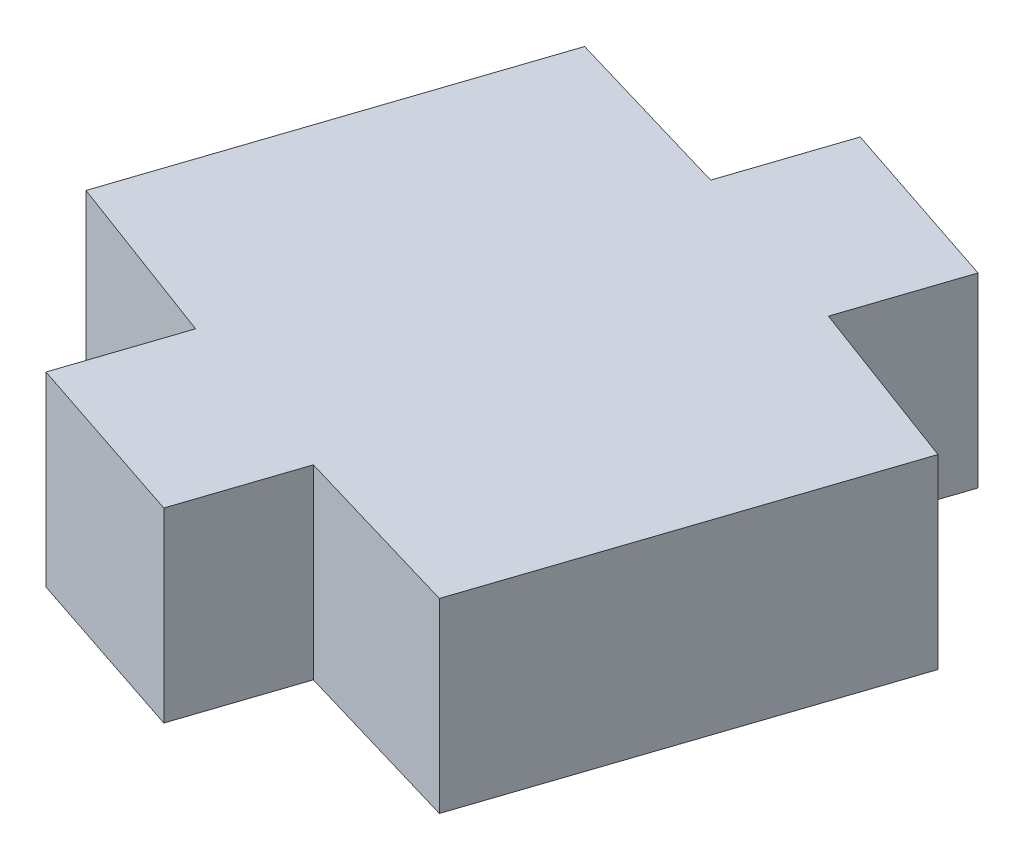
ISO-10303-21;
HEADER;
FILE_DESCRIPTION(('STEP AP214'),'2;1');
FILE_NAME('part.step','',(''),(''),'','','');
FILE_SCHEMA(('AUTOMOTIVE_DESIGN { 1 0 10303 214 1 1 1 1 }'));
ENDSEC;
DATA;
#1=APPLICATION_CONTEXT('core data for automotive mechanical design processes');
#2=APPLICATION_PROTOCOL_DEFINITION('international standard','automotive_design',2000,#1);
#3=PRODUCT_CONTEXT('',#1,'mechanical');
#4=PRODUCT('Part','Part','',(#3));
#5=PRODUCT_RELATED_PRODUCT_CATEGORY('part','',(#4));
#6=PRODUCT_DEFINITION_FORMATION('','',#4);
#7=PRODUCT_DEFINITION_CONTEXT('part definition',#1,'design');
#8=PRODUCT_DEFINITION('design','',#6,#7);
#9=PRODUCT_DEFINITION_SHAPE('','',#8);
#10=(LENGTH_UNIT() NAMED_UNIT(*) SI_UNIT(.MILLI.,.METRE.));
#11=(NAMED_UNIT(*) PLANE_ANGLE_UNIT() SI_UNIT($,.RADIAN.));
#12=(NAMED_UNIT(*) SI_UNIT($,.STERADIAN.) SOLID_ANGLE_UNIT());
#13=UNCERTAINTY_MEASURE_WITH_UNIT(LENGTH_MEASURE(1.E-05),#10,'distance_accuracy_value','');
#14=(GEOMETRIC_REPRESENTATION_CONTEXT(3) GLOBAL_UNCERTAINTY_ASSIGNED_CONTEXT((#13)) GLOBAL_UNIT_ASSIGNED_CONTEXT((#10,
#11,#12)) REPRESENTATION_CONTEXT('',''));
#15=CARTESIAN_POINT('',(0.,0.,0.));
#16=DIRECTION('',(0.,0.,1.));
#17=DIRECTION('',(1.,0.,0.));
#18=AXIS2_PLACEMENT_3D('',#15,#16,#17);
#19=CARTESIAN_POINT('',(-47.8363522570172,231.600000000012,-37.5041102484434));
#20=DIRECTION('',(-0.948683298050514,0.,-0.316227766016836));
#21=DIRECTION('',(-0.316227766016836,0.,0.948683298050514));
#22=AXIS2_PLACEMENT_3D('',#19,#20,#21);
#23=PLANE('',#22);
#24=DIRECTION('',(0.316227766016836,0.,-0.948683298050514));
#25=VECTOR('',#24,1.);
#26=CARTESIAN_POINT('',(-47.8363522570172,225.600000000012,-37.5041102484434));
#27=LINE('',#26,#25);
#28=CARTESIAN_POINT('',(-47.8363522570172,225.600000000012,-37.5041102484434));
#29=VERTEX_POINT('',#28);
#30=CARTESIAN_POINT('',(-46.631524468493,225.600000000012,-41.1185936140159));
#31=VERTEX_POINT('',#30);
#32=EDGE_CURVE('E153',#29,#31,#27,.T.);
#33=ORIENTED_EDGE('',*,*,#32,.T.);
#34=DIRECTION('',(0.,-1.,0.));
#35=VECTOR('',#34,1.);
#36=CARTESIAN_POINT('',(-46.631524468493,231.600000000012,-41.1185936140159));
#37=LINE('',#36,#35);
#38=CARTESIAN_POINT('',(-46.631524468493,231.600000000012,-41.1185936140159));
#39=VERTEX_POINT('',#38);
#40=EDGE_CURVE('E11',#39,#31,#37,.T.);
#41=ORIENTED_EDGE('',*,*,#40,.F.);
#42=DIRECTION('',(0.316227766016836,0.,-0.948683298050514));
#43=VECTOR('',#42,1.);
#44=CARTESIAN_POINT('',(-47.8363522570172,231.600000000012,-37.5041102484434));
#45=LINE('',#44,#43);
#46=CARTESIAN_POINT('',(-47.8363522570172,231.600000000012,-37.5041102484434));
#47=VERTEX_POINT('',#46);
#48=EDGE_CURVE('E175',#47,#39,#45,.T.);
#49=ORIENTED_EDGE('',*,*,#48,.F.);
#50=DIRECTION('',(0.,-1.,0.));
#51=VECTOR('',#50,1.);
#52=CARTESIAN_POINT('',(-47.8363522570172,231.600000000012,-37.5041102484434));
#53=LINE('',#52,#51);
#54=EDGE_CURVE('E149',#47,#29,#53,.T.);
#55=ORIENTED_EDGE('',*,*,#54,.T.);
#56=EDGE_LOOP('',(#33,#41,#49,#55));
#57=FACE_BOUND('',#56,.T.);
#58=ADVANCED_FACE('F33',(#57),#23,.F.);
#59=CARTESIAN_POINT('',(-46.631524468493,231.600000000012,-41.1185936140159));
#60=DIRECTION('',(0.28292655897394,0.,-0.95914157569525));
#61=DIRECTION('',(-0.959141575695249,0.,-0.28292655897394));
#62=AXIS2_PLACEMENT_3D('',#59,#60,#61);
#63=PLANE('',#62);
#64=DIRECTION('',(0.959141575695249,0.,0.28292655897394));
#65=VECTOR('',#64,1.);
#66=CARTESIAN_POINT('',(-46.631524468493,225.600000000012,-41.1185936140159));
#67=LINE('',#66,#65);
#68=CARTESIAN_POINT('',(-40.8731671786462,225.600000000012,-39.4199995225462));
#69=VERTEX_POINT('',#68);
#70=EDGE_CURVE('E156',#31,#69,#67,.T.);
#71=ORIENTED_EDGE('',*,*,#70,.T.);
#72=DIRECTION('',(0.,-1.,0.));
#73=VECTOR('',#72,1.);
#74=CARTESIAN_POINT('',(-40.8731671786462,231.600000000012,-39.4199995225462));
#75=LINE('',#74,#73);
#76=CARTESIAN_POINT('',(-40.8731671786462,231.600000000012,-39.4199995225462));
#77=VERTEX_POINT('',#76);
#78=EDGE_CURVE('E41',#77,#69,#75,.T.);
#79=ORIENTED_EDGE('',*,*,#78,.F.);
#80=DIRECTION('',(0.959141575695249,0.,0.28292655897394));
#81=VECTOR('',#80,1.);
#82=CARTESIAN_POINT('',(-46.631524468493,231.600000000012,-41.1185936140159));
#83=LINE('',#82,#81);
#84=EDGE_CURVE('E104',#39,#77,#83,.T.);
#85=ORIENTED_EDGE('',*,*,#84,.F.);
#86=ORIENTED_EDGE('',*,*,#40,.T.);
#87=EDGE_LOOP('',(#71,#79,#85,#86));
#88=FACE_BOUND('',#87,.T.);
#89=ADVANCED_FACE('F253',(#88),#63,.F.);
#90=CARTESIAN_POINT('',(-40.8731671786462,231.600000000012,-39.4199995225462));
#91=DIRECTION('',(-0.948683298050514,0.,-0.316227766016838));
#92=DIRECTION('',(-0.316227766016838,0.,0.948683298050514));
#93=AXIS2_PLACEMENT_3D('',#90,#91,#92);
#94=PLANE('',#93);
#95=DIRECTION('',(0.316227766016838,0.,-0.948683298050514));
#96=VECTOR('',#95,1.);
#97=CARTESIAN_POINT('',(-40.8731671786462,225.600000000012,-39.4199995225462));
#98=LINE('',#97,#96);
#99=CARTESIAN_POINT('',(-36.8570745502327,225.600000000012,-51.4682774077866));
#100=VERTEX_POINT('',#99);
#101=EDGE_CURVE('E158',#69,#100,#98,.T.);
#102=ORIENTED_EDGE('',*,*,#101,.T.);
#103=DIRECTION('',(0.,-1.,0.));
#104=VECTOR('',#103,1.);
#105=CARTESIAN_POINT('',(-36.8570745502327,231.600000000012,-51.4682774077866));
#106=LINE('',#105,#104);
#107=CARTESIAN_POINT('',(-36.8570745502327,231.600000000012,-51.4682774077866));
#108=VERTEX_POINT('',#107);
#109=EDGE_CURVE('E194',#108,#100,#106,.T.);
#110=ORIENTED_EDGE('',*,*,#109,.F.);
#111=DIRECTION('',(0.316227766016838,0.,-0.948683298050514));
#112=VECTOR('',#111,1.);
#113=CARTESIAN_POINT('',(-40.8731671786462,231.600000000012,-39.4199995225462));
#114=LINE('',#113,#112);
#115=EDGE_CURVE('E202',#77,#108,#114,.T.);
#116=ORIENTED_EDGE('',*,*,#115,.F.);
#117=ORIENTED_EDGE('',*,*,#78,.T.);
#118=EDGE_LOOP('',(#102,#110,#116,#117));
#119=FACE_BOUND('',#118,.T.);
#120=ADVANCED_FACE('F200',(#119),#94,.F.);
#121=CARTESIAN_POINT('',(-36.8570745502327,231.600000000012,-51.4682774077866));
#122=DIRECTION('',(-0.349143698238035,0.,0.937069195940549));
#123=DIRECTION('',(0.937069195940549,0.,0.349143698238035));
#124=AXIS2_PLACEMENT_3D('',#121,#122,#123);
#125=PLANE('',#124);
#126=DIRECTION('',(-0.93706919594055,0.,-0.349143698238035));
#127=VECTOR('',#126,1.);
#128=CARTESIAN_POINT('',(-36.8570745502327,225.600000000012,-51.4682774077866));
#129=LINE('',#128,#127);
#130=CARTESIAN_POINT('',(-42.4829168369919,225.600000000012,-53.5644165085192));
#131=VERTEX_POINT('',#130);
#132=EDGE_CURVE('E160',#100,#131,#129,.T.);
#133=ORIENTED_EDGE('',*,*,#132,.T.);
#134=DIRECTION('',(0.,-1.,0.));
#135=VECTOR('',#134,1.);
#136=CARTESIAN_POINT('',(-42.4829168369919,231.600000000012,-53.5644165085192));
#137=LINE('',#136,#135);
#138=CARTESIAN_POINT('',(-42.4829168369919,231.600000000012,-53.5644165085192));
#139=VERTEX_POINT('',#138);
#140=EDGE_CURVE('E191',#139,#131,#137,.T.);
#141=ORIENTED_EDGE('',*,*,#140,.F.);
#142=DIRECTION('',(-0.93706919594055,0.,-0.349143698238035));
#143=VECTOR('',#142,1.);
#144=CARTESIAN_POINT('',(-36.8570745502327,231.600000000012,-51.4682774077866));
#145=LINE('',#144,#143);
#146=EDGE_CURVE('E220',#108,#139,#145,.T.);
#147=ORIENTED_EDGE('',*,*,#146,.F.);
#148=ORIENTED_EDGE('',*,*,#109,.T.);
#149=EDGE_LOOP('',(#133,#141,#147,#148));
#150=FACE_BOUND('',#149,.T.);
#151=ADVANCED_FACE('F211',(#150),#125,.F.);
#152=CARTESIAN_POINT('',(-42.4829168369919,231.600000000012,-53.5644165085192));
#153=DIRECTION('',(-0.948683298050513,0.,-0.316227766016841));
#154=DIRECTION('',(-0.316227766016841,0.,0.948683298050513));
#155=AXIS2_PLACEMENT_3D('',#152,#153,#154);
#156=PLANE('',#155);
#157=DIRECTION('',(0.316227766016841,0.,-0.948683298050513));
#158=VECTOR('',#157,1.);
#159=CARTESIAN_POINT('',(-42.4829168369919,225.600000000012,-53.5644165085192));
#160=LINE('',#159,#158);
#161=CARTESIAN_POINT('',(-41.2780890484678,225.600000000012,-57.1788998740916));
#162=VERTEX_POINT('',#161);
#163=EDGE_CURVE('E162',#131,#162,#160,.T.);
#164=ORIENTED_EDGE('',*,*,#163,.T.);
#165=DIRECTION('',(0.,-1.,0.));
#166=VECTOR('',#165,1.);
#167=CARTESIAN_POINT('',(-41.2780890484678,231.600000000012,-57.1788998740916));
#168=LINE('',#167,#166);
#169=CARTESIAN_POINT('',(-41.2780890484678,231.600000000012,-57.1788998740916));
#170=VERTEX_POINT('',#169);
#171=EDGE_CURVE('E188',#170,#162,#168,.T.);
#172=ORIENTED_EDGE('',*,*,#171,.F.);
#173=DIRECTION('',(0.316227766016841,0.,-0.948683298050513));
#174=VECTOR('',#173,1.);
#175=CARTESIAN_POINT('',(-42.4829168369919,231.600000000012,-53.5644165085192));
#176=LINE('',#175,#174);
#177=EDGE_CURVE('E217',#139,#170,#176,.T.);
#178=ORIENTED_EDGE('',*,*,#177,.F.);
#179=ORIENTED_EDGE('',*,*,#140,.T.);
#180=EDGE_LOOP('',(#164,#172,#178,#179));
#181=FACE_BOUND('',#180,.T.);
#182=ADVANCED_FACE('F215',(#181),#156,.F.);
#183=CARTESIAN_POINT('',(-41.2780890484678,231.600000000012,-57.1788998740916));
#184=DIRECTION('',(-0.316227766016839,0.,0.948683298050513));
#185=DIRECTION('',(0.948683298050513,0.,0.316227766016839));
#186=AXIS2_PLACEMENT_3D('',#183,#184,#185);
#187=PLANE('',#186);
#188=DIRECTION('',(-0.948683298050513,0.,-0.316227766016839));
#189=VECTOR('',#188,1.);
#190=CARTESIAN_POINT('',(-41.2780890484678,225.600000000012,-57.1788998740916));
#191=LINE('',#190,#189);
#192=CARTESIAN_POINT('',(-46.9701888367709,225.600000000012,-59.0762664701927));
#193=VERTEX_POINT('',#192);
#194=EDGE_CURVE('E164',#162,#193,#191,.T.);
#195=ORIENTED_EDGE('',*,*,#194,.T.);
#196=DIRECTION('',(0.,-1.,0.));
#197=VECTOR('',#196,1.);
#198=CARTESIAN_POINT('',(-46.9701888367709,231.600000000012,-59.0762664701927));
#199=LINE('',#198,#197);
#200=CARTESIAN_POINT('',(-46.9701888367709,231.600000000012,-59.0762664701927));
#201=VERTEX_POINT('',#200);
#202=EDGE_CURVE('E185',#201,#193,#199,.T.);
#203=ORIENTED_EDGE('',*,*,#202,.F.);
#204=DIRECTION('',(-0.948683298050513,0.,-0.316227766016839));
#205=VECTOR('',#204,1.);
#206=CARTESIAN_POINT('',(-41.2780890484678,231.600000000012,-57.1788998740916));
#207=LINE('',#206,#205);
#208=EDGE_CURVE('E219',#170,#201,#207,.T.);
#209=ORIENTED_EDGE('',*,*,#208,.F.);
#210=ORIENTED_EDGE('',*,*,#171,.T.);
#211=EDGE_LOOP('',(#195,#203,#209,#210));
#212=FACE_BOUND('',#211,.T.);
#213=ADVANCED_FACE('F266',(#212),#187,.F.);
#214=CARTESIAN_POINT('',(-46.9701888367709,231.600000000012,-59.0762664701927));
#215=DIRECTION('',(0.948683298050516,0.,0.31622776601683));
#216=DIRECTION('',(0.31622776601683,0.,-0.948683298050517));
#217=AXIS2_PLACEMENT_3D('',#214,#215,#216);
#218=PLANE('',#217);
#219=DIRECTION('',(-0.31622776601683,0.,0.948683298050516));
#220=VECTOR('',#219,1.);
#221=CARTESIAN_POINT('',(-46.9701888367709,225.600000000012,-59.0762664701927));
#222=LINE('',#221,#220);
#223=CARTESIAN_POINT('',(-48.175016625295,225.600000000012,-55.4617831046202));
#224=VERTEX_POINT('',#223);
#225=EDGE_CURVE('E166',#193,#224,#222,.T.);
#226=ORIENTED_EDGE('',*,*,#225,.T.);
#227=DIRECTION('',(0.,-1.,0.));
#228=VECTOR('',#227,1.);
#229=CARTESIAN_POINT('',(-48.175016625295,231.600000000012,-55.4617831046202));
#230=LINE('',#229,#228);
#231=CARTESIAN_POINT('',(-48.175016625295,231.600000000012,-55.4617831046202));
#232=VERTEX_POINT('',#231);
#233=EDGE_CURVE('E182',#232,#224,#230,.T.);
#234=ORIENTED_EDGE('',*,*,#233,.F.);
#235=DIRECTION('',(-0.31622776601683,0.,0.948683298050516));
#236=VECTOR('',#235,1.);
#237=CARTESIAN_POINT('',(-46.9701888367709,231.600000000012,-59.0762664701927));
#238=LINE('',#237,#236);
#239=EDGE_CURVE('E222',#201,#232,#238,.T.);
#240=ORIENTED_EDGE('',*,*,#239,.F.);
#241=ORIENTED_EDGE('',*,*,#202,.T.);
#242=EDGE_LOOP('',(#226,#234,#240,#241));
#243=FACE_BOUND('',#242,.T.);
#244=ADVANCED_FACE('F269',(#243),#218,.F.);
#245=CARTESIAN_POINT('',(-48.175016625295,231.600000000012,-55.4617831046202));
#246=DIRECTION('',(-0.282926558974016,0.,0.959141575695227));
#247=DIRECTION('',(0.959141575695227,0.,0.282926558974016));
#248=AXIS2_PLACEMENT_3D('',#245,#246,#247);
#249=PLANE('',#248);
#250=DIRECTION('',(-0.959141575695227,0.,-0.282926558974016));
#251=VECTOR('',#250,1.);
#252=CARTESIAN_POINT('',(-48.175016625295,225.600000000012,-55.4617831046202));
#253=LINE('',#252,#251);
#254=CARTESIAN_POINT('',(-53.9333739151417,225.600000000012,-57.1603771960903));
#255=VERTEX_POINT('',#254);
#256=EDGE_CURVE('E168',#224,#255,#253,.T.);
#257=ORIENTED_EDGE('',*,*,#256,.T.);
#258=DIRECTION('',(0.,-1.,0.));
#259=VECTOR('',#258,1.);
#260=CARTESIAN_POINT('',(-53.9333739151417,231.600000000012,-57.1603771960903));
#261=LINE('',#260,#259);
#262=CARTESIAN_POINT('',(-53.9333739151417,231.600000000012,-57.1603771960903));
#263=VERTEX_POINT('',#262);
#264=EDGE_CURVE('E179',#263,#255,#261,.T.);
#265=ORIENTED_EDGE('',*,*,#264,.F.);
#266=DIRECTION('',(-0.959141575695227,0.,-0.282926558974016));
#267=VECTOR('',#266,1.);
#268=CARTESIAN_POINT('',(-48.175016625295,231.600000000012,-55.4617831046202));
#269=LINE('',#268,#267);
#270=EDGE_CURVE('E228',#232,#263,#269,.T.);
#271=ORIENTED_EDGE('',*,*,#270,.F.);
#272=ORIENTED_EDGE('',*,*,#233,.T.);
#273=EDGE_LOOP('',(#257,#265,#271,#272));
#274=FACE_BOUND('',#273,.T.);
#275=ADVANCED_FACE('F234',(#274),#249,.F.);
#276=CARTESIAN_POINT('',(-53.9333739151417,231.600000000012,-57.1603771960903));
#277=DIRECTION('',(0.948683298050514,0.,0.316227766016839));
#278=DIRECTION('',(0.316227766016839,0.,-0.948683298050514));
#279=AXIS2_PLACEMENT_3D('',#276,#277,#278);
#280=PLANE('',#279);
#281=DIRECTION('',(-0.316227766016839,0.,0.948683298050513));
#282=VECTOR('',#281,1.);
#283=CARTESIAN_POINT('',(-53.9333739151417,225.600000000012,-57.1603771960903));
#284=LINE('',#283,#282);
#285=CARTESIAN_POINT('',(-57.9494665435556,225.600000000012,-45.1120993108488));
#286=VERTEX_POINT('',#285);
#287=EDGE_CURVE('E170',#255,#286,#284,.T.);
#288=ORIENTED_EDGE('',*,*,#287,.T.);
#289=DIRECTION('',(0.,-1.,0.));
#290=VECTOR('',#289,1.);
#291=CARTESIAN_POINT('',(-57.9494665435556,231.600000000012,-45.1120993108488));
#292=LINE('',#291,#290);
#293=CARTESIAN_POINT('',(-57.9494665435556,231.600000000012,-45.1120993108488));
#294=VERTEX_POINT('',#293);
#295=EDGE_CURVE('E144',#294,#286,#292,.T.);
#296=ORIENTED_EDGE('',*,*,#295,.F.);
#297=DIRECTION('',(-0.316227766016839,0.,0.948683298050513));
#298=VECTOR('',#297,1.);
#299=CARTESIAN_POINT('',(-53.9333739151417,231.600000000012,-57.1603771960903));
#300=LINE('',#299,#298);
#301=EDGE_CURVE('E135',#263,#294,#300,.T.);
#302=ORIENTED_EDGE('',*,*,#301,.F.);
#303=ORIENTED_EDGE('',*,*,#264,.T.);
#304=EDGE_LOOP('',(#288,#296,#302,#303));
#305=FACE_BOUND('',#304,.T.);
#306=ADVANCED_FACE('F238',(#305),#280,.F.);
#307=CARTESIAN_POINT('',(-57.9494665435556,231.600000000012,-45.1120993108488));
#308=DIRECTION('',(0.349143698237928,0.,-0.937069195940589));
#309=DIRECTION('',(-0.93706919594059,0.,-0.349143698237928));
#310=AXIS2_PLACEMENT_3D('',#307,#308,#309);
#311=PLANE('',#310);
#312=DIRECTION('',(0.93706919594059,0.,0.349143698237928));
#313=VECTOR('',#312,1.);
#314=CARTESIAN_POINT('',(-57.9494665435556,225.600000000012,-45.1120993108488));
#315=LINE('',#314,#313);
#316=CARTESIAN_POINT('',(-52.3236242567961,225.600000000012,-43.0159602101169));
#317=VERTEX_POINT('',#316);
#318=EDGE_CURVE('E143',#286,#317,#315,.T.);
#319=ORIENTED_EDGE('',*,*,#318,.T.);
#320=DIRECTION('',(0.,-1.,0.));
#321=VECTOR('',#320,1.);
#322=CARTESIAN_POINT('',(-52.3236242567961,231.600000000012,-43.0159602101169));
#323=LINE('',#322,#321);
#324=CARTESIAN_POINT('',(-52.3236242567961,231.600000000012,-43.0159602101169));
#325=VERTEX_POINT('',#324);
#326=EDGE_CURVE('E140',#325,#317,#323,.T.);
#327=ORIENTED_EDGE('',*,*,#326,.F.);
#328=DIRECTION('',(0.93706919594059,0.,0.349143698237928));
#329=VECTOR('',#328,1.);
#330=CARTESIAN_POINT('',(-57.9494665435556,231.600000000012,-45.1120993108488));
#331=LINE('',#330,#329);
#332=EDGE_CURVE('E129',#294,#325,#331,.T.);
#333=ORIENTED_EDGE('',*,*,#332,.F.);
#334=ORIENTED_EDGE('',*,*,#295,.T.);
#335=EDGE_LOOP('',(#319,#327,#333,#334));
#336=FACE_BOUND('',#335,.T.);
#337=ADVANCED_FACE('F141',(#336),#311,.F.);
#338=CARTESIAN_POINT('',(-52.3236242567961,231.600000000012,-43.0159602101169));
#339=DIRECTION('',(0.948683298050514,0.,0.316227766016836));
#340=DIRECTION('',(0.316227766016836,0.,-0.948683298050514));
#341=AXIS2_PLACEMENT_3D('',#338,#339,#340);
#342=PLANE('',#341);
#343=DIRECTION('',(-0.316227766016836,0.,0.948683298050514));
#344=VECTOR('',#343,1.);
#345=CARTESIAN_POINT('',(-52.3236242567961,225.600000000012,-43.0159602101169));
#346=LINE('',#345,#344);
#347=CARTESIAN_POINT('',(-53.5284520453203,225.600000000012,-39.4014768445444));
#348=VERTEX_POINT('',#347);
#349=EDGE_CURVE('E90',#317,#348,#346,.T.);
#350=ORIENTED_EDGE('',*,*,#349,.T.);
#351=DIRECTION('',(0.,-1.,0.));
#352=VECTOR('',#351,1.);
#353=CARTESIAN_POINT('',(-53.5284520453203,231.600000000012,-39.4014768445444));
#354=LINE('',#353,#352);
#355=CARTESIAN_POINT('',(-53.5284520453203,231.600000000012,-39.4014768445444));
#356=VERTEX_POINT('',#355);
#357=EDGE_CURVE('E145',#356,#348,#354,.T.);
#358=ORIENTED_EDGE('',*,*,#357,.F.);
#359=DIRECTION('',(-0.316227766016836,0.,0.948683298050514));
#360=VECTOR('',#359,1.);
#361=CARTESIAN_POINT('',(-52.3236242567961,231.600000000012,-43.0159602101169));
#362=LINE('',#361,#360);
#363=EDGE_CURVE('E133',#325,#356,#362,.T.);
#364=ORIENTED_EDGE('',*,*,#363,.F.);
#365=ORIENTED_EDGE('',*,*,#326,.T.);
#366=EDGE_LOOP('',(#350,#358,#364,#365));
#367=FACE_BOUND('',#366,.T.);
#368=ADVANCED_FACE('F147',(#367),#342,.F.);
#369=CARTESIAN_POINT('',(-53.5284520453203,231.600000000012,-39.4014768445444));
#370=DIRECTION('',(0.316227766016838,0.,-0.948683298050514));
#371=DIRECTION('',(-0.948683298050514,0.,-0.316227766016838));
#372=AXIS2_PLACEMENT_3D('',#369,#370,#371);
#373=PLANE('',#372);
#374=DIRECTION('',(0.948683298050514,0.,0.316227766016838));
#375=VECTOR('',#374,1.);
#376=CARTESIAN_POINT('',(-53.5284520453203,225.600000000012,-39.4014768445444));
#377=LINE('',#376,#375);
#378=EDGE_CURVE('E96',#348,#29,#377,.T.);
#379=ORIENTED_EDGE('',*,*,#378,.T.);
#380=ORIENTED_EDGE('',*,*,#54,.F.);
#381=DIRECTION('',(0.948683298050514,0.,0.316227766016838));
#382=VECTOR('',#381,1.);
#383=CARTESIAN_POINT('',(-53.5284520453203,231.600000000012,-39.4014768445444));
#384=LINE('',#383,#382);
#385=EDGE_CURVE('E49',#356,#47,#384,.T.);
#386=ORIENTED_EDGE('',*,*,#385,.F.);
#387=ORIENTED_EDGE('',*,*,#357,.T.);
#388=EDGE_LOOP('',(#379,#380,#386,#387));
#389=FACE_BOUND('',#388,.T.);
#390=ADVANCED_FACE('F242',(#389),#373,.F.);
#391=CARTESIAN_POINT('',(0.,231.600000000012,0.));
#392=DIRECTION('',(0.,1.,0.));
#393=DIRECTION('',(0.,0.,1.));
#394=AXIS2_PLACEMENT_3D('',#391,#392,#393);
#395=PLANE('',#394);
#396=ORIENTED_EDGE('',*,*,#48,.T.);
#397=ORIENTED_EDGE('',*,*,#84,.T.);
#398=ORIENTED_EDGE('',*,*,#115,.T.);
#399=ORIENTED_EDGE('',*,*,#146,.T.);
#400=ORIENTED_EDGE('',*,*,#177,.T.);
#401=ORIENTED_EDGE('',*,*,#208,.T.);
#402=ORIENTED_EDGE('',*,*,#239,.T.);
#403=ORIENTED_EDGE('',*,*,#270,.T.);
#404=ORIENTED_EDGE('',*,*,#301,.T.);
#405=ORIENTED_EDGE('',*,*,#332,.T.);
#406=ORIENTED_EDGE('',*,*,#363,.T.);
#407=ORIENTED_EDGE('',*,*,#385,.T.);
#408=EDGE_LOOP('',(#396,#397,#398,#399,#400,#401,#402,#403,#404,#405,#406,#407));
#409=FACE_BOUND('',#408,.T.);
#410=ADVANCED_FACE('F131',(#409),#395,.T.);
#411=CARTESIAN_POINT('',(0.,225.600000000012,0.));
#412=DIRECTION('',(0.,1.,0.));
#413=DIRECTION('',(0.,0.,1.));
#414=AXIS2_PLACEMENT_3D('',#411,#412,#413);
#415=PLANE('',#414);
#416=ORIENTED_EDGE('',*,*,#32,.F.);
#417=ORIENTED_EDGE('',*,*,#378,.F.);
#418=ORIENTED_EDGE('',*,*,#349,.F.);
#419=ORIENTED_EDGE('',*,*,#318,.F.);
#420=ORIENTED_EDGE('',*,*,#287,.F.);
#421=ORIENTED_EDGE('',*,*,#256,.F.);
#422=ORIENTED_EDGE('',*,*,#225,.F.);
#423=ORIENTED_EDGE('',*,*,#194,.F.);
#424=ORIENTED_EDGE('',*,*,#163,.F.);
#425=ORIENTED_EDGE('',*,*,#132,.F.);
#426=ORIENTED_EDGE('',*,*,#101,.F.);
#427=ORIENTED_EDGE('',*,*,#70,.F.);
#428=EDGE_LOOP('',(#416,#417,#418,#419,#420,#421,#422,#423,#424,#425,#426,#427));
#429=FACE_BOUND('',#428,.T.);
#430=ADVANCED_FACE('F206',(#429),#415,.F.);
#431=CLOSED_SHELL('',(#58,#89,#120,#151,#182,#213,#244,#275,#306,#337,#368,#390,#410,#430));
#432=MANIFOLD_SOLID_BREP('B2',#431);
#433=ADVANCED_BREP_SHAPE_REPRESENTATION('',(#18,#432),#14);
#434=SHAPE_DEFINITION_REPRESENTATION(#9,#433);
ENDSEC;
END-ISO-10303-21;
